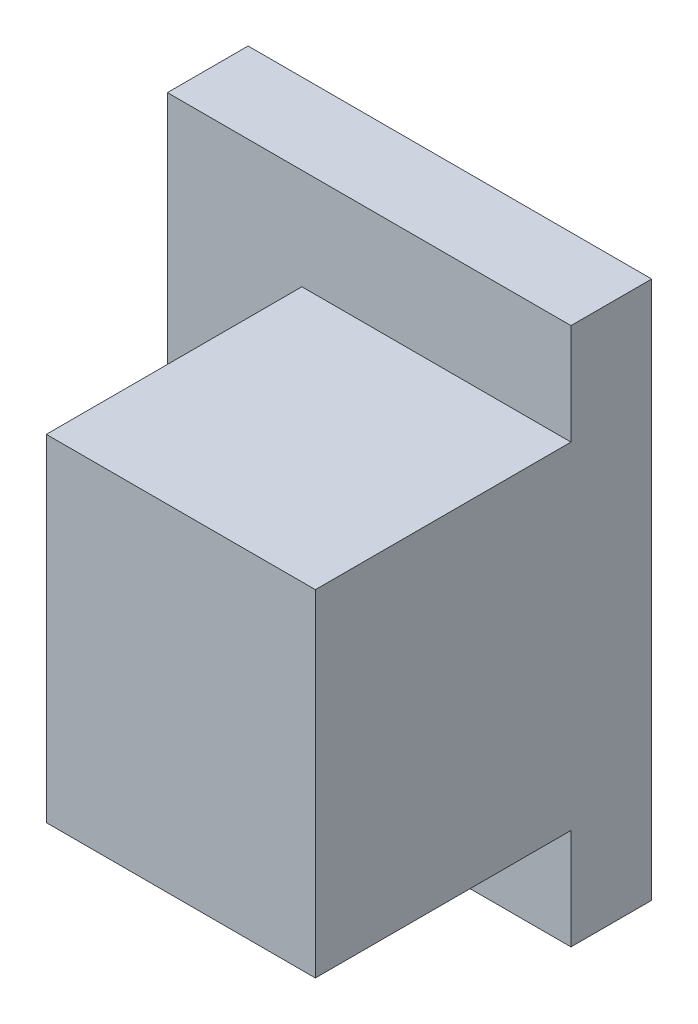
ISO-10303-21;
HEADER;
FILE_DESCRIPTION(('STEP AP214'),'2;1');
FILE_NAME('part.step','',(''),(''),'','','');
FILE_SCHEMA(('AUTOMOTIVE_DESIGN { 1 0 10303 214 1 1 1 1 }'));
ENDSEC;
DATA;
#1=APPLICATION_CONTEXT('core data for automotive mechanical design processes');
#2=APPLICATION_PROTOCOL_DEFINITION('international standard','automotive_design',2000,#1);
#3=PRODUCT_CONTEXT('',#1,'mechanical');
#4=PRODUCT('Part','Part','',(#3));
#5=PRODUCT_RELATED_PRODUCT_CATEGORY('part','',(#4));
#6=PRODUCT_DEFINITION_FORMATION('','',#4);
#7=PRODUCT_DEFINITION_CONTEXT('part definition',#1,'design');
#8=PRODUCT_DEFINITION('design','',#6,#7);
#9=PRODUCT_DEFINITION_SHAPE('','',#8);
#10=(LENGTH_UNIT() NAMED_UNIT(*) SI_UNIT(.MILLI.,.METRE.));
#11=(NAMED_UNIT(*) PLANE_ANGLE_UNIT() SI_UNIT($,.RADIAN.));
#12=(NAMED_UNIT(*) SI_UNIT($,.STERADIAN.) SOLID_ANGLE_UNIT());
#13=UNCERTAINTY_MEASURE_WITH_UNIT(LENGTH_MEASURE(1.E-05),#10,'distance_accuracy_value','');
#14=(GEOMETRIC_REPRESENTATION_CONTEXT(3) GLOBAL_UNCERTAINTY_ASSIGNED_CONTEXT((#13)) GLOBAL_UNIT_ASSIGNED_CONTEXT((#10,
#11,#12)) REPRESENTATION_CONTEXT('',''));
#15=CARTESIAN_POINT('',(0.,0.,0.));
#16=DIRECTION('',(0.,0.,1.));
#17=DIRECTION('',(1.,0.,0.));
#18=AXIS2_PLACEMENT_3D('',#15,#16,#17);
#19=CARTESIAN_POINT('',(-1.,4.,4.));
#20=DIRECTION('',(1.,0.,0.));
#21=DIRECTION('',(0.,1.,0.));
#22=AXIS2_PLACEMENT_3D('',#19,#20,#21);
#23=PLANE('',#22);
#24=DIRECTION('',(0.,-1.,0.));
#25=VECTOR('',#24,1.);
#26=CARTESIAN_POINT('',(-1.,4.,1.2));
#27=LINE('',#26,#25);
#28=CARTESIAN_POINT('',(-1.,4.,1.2));
#29=VERTEX_POINT('',#28);
#30=CARTESIAN_POINT('',(-0.999999999999999,-1.,1.2));
#31=VERTEX_POINT('',#30);
#32=EDGE_CURVE('E53',#29,#31,#27,.T.);
#33=ORIENTED_EDGE('',*,*,#32,.T.);
#34=DIRECTION('',(0.,0.,-1.));
#35=VECTOR('',#34,1.);
#36=CARTESIAN_POINT('',(-0.999999999999999,-1.,4.));
#37=LINE('',#36,#35);
#38=CARTESIAN_POINT('',(-0.999999999999999,-1.,5.));
#39=VERTEX_POINT('',#38);
#40=EDGE_CURVE('E11',#39,#31,#37,.T.);
#41=ORIENTED_EDGE('',*,*,#40,.F.);
#42=DIRECTION('',(0.,-1.,0.));
#43=VECTOR('',#42,1.);
#44=CARTESIAN_POINT('',(-1.,4.,5.));
#45=LINE('',#44,#43);
#46=CARTESIAN_POINT('',(-1.,4.,5.));
#47=VERTEX_POINT('',#46);
#48=EDGE_CURVE('E137',#47,#39,#45,.T.);
#49=ORIENTED_EDGE('',*,*,#48,.F.);
#50=DIRECTION('',(0.,0.,-1.));
#51=VECTOR('',#50,1.);
#52=CARTESIAN_POINT('',(-1.,4.,4.));
#53=LINE('',#52,#51);
#54=EDGE_CURVE('E126',#47,#29,#53,.T.);
#55=ORIENTED_EDGE('',*,*,#54,.T.);
#56=EDGE_LOOP('',(#33,#41,#49,#55));
#57=FACE_BOUND('',#56,.T.);
#58=ADVANCED_FACE('F39',(#57),#23,.F.);
#59=CARTESIAN_POINT('',(-0.999999999999999,-1.,4.));
#60=DIRECTION('',(0.,1.,0.));
#61=DIRECTION('',(0.,0.,1.));
#62=AXIS2_PLACEMENT_3D('',#59,#60,#61);
#63=PLANE('',#62);
#64=DIRECTION('',(1.,0.,0.));
#65=VECTOR('',#64,1.);
#66=CARTESIAN_POINT('',(-0.999999999999999,-1.,1.2));
#67=LINE('',#66,#65);
#68=CARTESIAN_POINT('',(3.,-1.,1.2));
#69=VERTEX_POINT('',#68);
#70=EDGE_CURVE('E59',#31,#69,#67,.T.);
#71=ORIENTED_EDGE('',*,*,#70,.T.);
#72=DIRECTION('',(0.,0.,-1.));
#73=VECTOR('',#72,1.);
#74=CARTESIAN_POINT('',(3.,-1.,4.));
#75=LINE('',#74,#73);
#76=CARTESIAN_POINT('',(3.,-1.,5.));
#77=VERTEX_POINT('',#76);
#78=EDGE_CURVE('E46',#77,#69,#75,.T.);
#79=ORIENTED_EDGE('',*,*,#78,.F.);
#80=DIRECTION('',(1.,0.,0.));
#81=VECTOR('',#80,1.);
#82=CARTESIAN_POINT('',(-0.999999999999999,-1.,5.));
#83=LINE('',#82,#81);
#84=EDGE_CURVE('E141',#39,#77,#83,.T.);
#85=ORIENTED_EDGE('',*,*,#84,.F.);
#86=ORIENTED_EDGE('',*,*,#40,.T.);
#87=EDGE_LOOP('',(#71,#79,#85,#86));
#88=FACE_BOUND('',#87,.T.);
#89=ADVANCED_FACE('F254',(#88),#63,.F.);
#90=CARTESIAN_POINT('',(-1.,4.,4.));
#91=DIRECTION('',(0.,-1.,0.));
#92=DIRECTION('',(0.,0.,-1.));
#93=AXIS2_PLACEMENT_3D('',#90,#91,#92);
#94=PLANE('',#93);
#95=DIRECTION('',(-1.,0.,0.));
#96=VECTOR('',#95,1.);
#97=CARTESIAN_POINT('',(3.,4.,1.2));
#98=LINE('',#97,#96);
#99=CARTESIAN_POINT('',(3.,4.,1.2));
#100=VERTEX_POINT('',#99);
#101=EDGE_CURVE('E132',#100,#29,#98,.T.);
#102=ORIENTED_EDGE('',*,*,#101,.T.);
#103=ORIENTED_EDGE('',*,*,#54,.F.);
#104=DIRECTION('',(-1.,0.,0.));
#105=VECTOR('',#104,1.);
#106=CARTESIAN_POINT('',(3.,4.,5.));
#107=LINE('',#106,#105);
#108=CARTESIAN_POINT('',(3.,4.,5.));
#109=VERTEX_POINT('',#108);
#110=EDGE_CURVE('E130',#109,#47,#107,.T.);
#111=ORIENTED_EDGE('',*,*,#110,.F.);
#112=DIRECTION('',(0.,0.,-1.));
#113=VECTOR('',#112,1.);
#114=CARTESIAN_POINT('',(3.,4.,4.));
#115=LINE('',#114,#113);
#116=EDGE_CURVE('E133',#109,#100,#115,.T.);
#117=ORIENTED_EDGE('',*,*,#116,.T.);
#118=EDGE_LOOP('',(#102,#103,#111,#117));
#119=FACE_BOUND('',#118,.T.);
#120=ADVANCED_FACE('F128',(#119),#94,.F.);
#121=CARTESIAN_POINT('',(0.,0.,0.));
#122=DIRECTION('',(0.,0.,1.));
#123=DIRECTION('',(1.,0.,0.));
#124=AXIS2_PLACEMENT_3D('',#121,#122,#123);
#125=PLANE('',#124);
#126=DIRECTION('',(0.,1.,0.));
#127=VECTOR('',#126,1.);
#128=CARTESIAN_POINT('',(3.,4.,0.));
#129=LINE('',#128,#127);
#130=CARTESIAN_POINT('',(3.,-2.5,0.));
#131=VERTEX_POINT('',#130);
#132=CARTESIAN_POINT('',(3.,5.5,0.));
#133=VERTEX_POINT('',#132);
#134=EDGE_CURVE('E134',#131,#133,#129,.T.);
#135=ORIENTED_EDGE('',*,*,#134,.F.);
#136=DIRECTION('',(-1.,0.,0.));
#137=VECTOR('',#136,1.);
#138=CARTESIAN_POINT('',(3.,-2.5,0.));
#139=LINE('',#138,#137);
#140=CARTESIAN_POINT('',(-3.,-2.5,0.));
#141=VERTEX_POINT('',#140);
#142=EDGE_CURVE('E151',#131,#141,#139,.T.);
#143=ORIENTED_EDGE('',*,*,#142,.T.);
#144=DIRECTION('',(0.,1.,0.));
#145=VECTOR('',#144,1.);
#146=CARTESIAN_POINT('',(-3.,-2.5,0.));
#147=LINE('',#146,#145);
#148=CARTESIAN_POINT('',(-3.,5.5,0.));
#149=VERTEX_POINT('',#148);
#150=EDGE_CURVE('E174',#141,#149,#147,.T.);
#151=ORIENTED_EDGE('',*,*,#150,.T.);
#152=DIRECTION('',(1.,0.,0.));
#153=VECTOR('',#152,1.);
#154=CARTESIAN_POINT('',(-3.,5.5,0.));
#155=LINE('',#154,#153);
#156=EDGE_CURVE('E155',#149,#133,#155,.T.);
#157=ORIENTED_EDGE('',*,*,#156,.T.);
#158=EDGE_LOOP('',(#135,#143,#151,#157));
#159=FACE_BOUND('',#158,.T.);
#160=DIRECTION('',(0.,-1.,0.));
#161=VECTOR('',#160,1.);
#162=CARTESIAN_POINT('',(0.,0.,0.));
#163=LINE('',#162,#161);
#164=CARTESIAN_POINT('',(0.,3.,0.));
#165=VERTEX_POINT('',#164);
#166=CARTESIAN_POINT('',(0.,0.,0.));
#167=VERTEX_POINT('',#166);
#168=EDGE_CURVE('E182',#165,#167,#163,.T.);
#169=ORIENTED_EDGE('',*,*,#168,.T.);
#170=DIRECTION('',(1.,0.,0.));
#171=VECTOR('',#170,1.);
#172=CARTESIAN_POINT('',(0.,0.,0.));
#173=LINE('',#172,#171);
#174=CARTESIAN_POINT('',(2.,0.,0.));
#175=VERTEX_POINT('',#174);
#176=EDGE_CURVE('E205',#167,#175,#173,.T.);
#177=ORIENTED_EDGE('',*,*,#176,.T.);
#178=DIRECTION('',(0.,1.,0.));
#179=VECTOR('',#178,1.);
#180=CARTESIAN_POINT('',(2.,0.,0.));
#181=LINE('',#180,#179);
#182=CARTESIAN_POINT('',(2.,3.,0.));
#183=VERTEX_POINT('',#182);
#184=EDGE_CURVE('E208',#175,#183,#181,.T.);
#185=ORIENTED_EDGE('',*,*,#184,.T.);
#186=DIRECTION('',(-1.,0.,0.));
#187=VECTOR('',#186,1.);
#188=CARTESIAN_POINT('',(0.,3.,0.));
#189=LINE('',#188,#187);
#190=EDGE_CURVE('E193',#183,#165,#189,.T.);
#191=ORIENTED_EDGE('',*,*,#190,.T.);
#192=EDGE_LOOP('',(#169,#177,#185,#191));
#193=FACE_BOUND('',#192,.T.);
#194=ADVANCED_FACE('F240',(#159,#193),#125,.F.);
#195=CARTESIAN_POINT('',(3.,4.,4.));
#196=DIRECTION('',(-1.,0.,0.));
#197=DIRECTION('',(0.,-1.,0.));
#198=AXIS2_PLACEMENT_3D('',#195,#196,#197);
#199=PLANE('',#198);
#200=ORIENTED_EDGE('',*,*,#134,.T.);
#201=DIRECTION('',(0.,0.,-1.));
#202=VECTOR('',#201,1.);
#203=CARTESIAN_POINT('',(3.,5.5,1.2));
#204=LINE('',#203,#202);
#205=CARTESIAN_POINT('',(3.,5.5,1.2));
#206=VERTEX_POINT('',#205);
#207=EDGE_CURVE('E179',#206,#133,#204,.T.);
#208=ORIENTED_EDGE('',*,*,#207,.F.);
#209=DIRECTION('',(0.,-1.,0.));
#210=VECTOR('',#209,1.);
#211=CARTESIAN_POINT('',(3.,5.5,1.2));
#212=LINE('',#211,#210);
#213=EDGE_CURVE('E152',#206,#100,#212,.T.);
#214=ORIENTED_EDGE('',*,*,#213,.T.);
#215=ORIENTED_EDGE('',*,*,#116,.F.);
#216=DIRECTION('',(0.,1.,0.));
#217=VECTOR('',#216,1.);
#218=CARTESIAN_POINT('',(3.,-1.,5.));
#219=LINE('',#218,#217);
#220=EDGE_CURVE('E146',#77,#109,#219,.T.);
#221=ORIENTED_EDGE('',*,*,#220,.F.);
#222=ORIENTED_EDGE('',*,*,#78,.T.);
#223=DIRECTION('',(0.,-1.,0.));
#224=VECTOR('',#223,1.);
#225=CARTESIAN_POINT('',(3.,-1.,1.2));
#226=LINE('',#225,#224);
#227=CARTESIAN_POINT('',(3.,-2.5,1.2));
#228=VERTEX_POINT('',#227);
#229=EDGE_CURVE('E159',#69,#228,#226,.T.);
#230=ORIENTED_EDGE('',*,*,#229,.T.);
#231=DIRECTION('',(0.,0.,-1.));
#232=VECTOR('',#231,1.);
#233=CARTESIAN_POINT('',(3.,-2.5,1.2));
#234=LINE('',#233,#232);
#235=EDGE_CURVE('E171',#228,#131,#234,.T.);
#236=ORIENTED_EDGE('',*,*,#235,.T.);
#237=EDGE_LOOP('',(#200,#208,#214,#215,#221,#222,#230,#236));
#238=FACE_BOUND('',#237,.T.);
#239=ADVANCED_FACE('F225',(#238),#199,.F.);
#240=CARTESIAN_POINT('',(0.,0.,4.));
#241=DIRECTION('',(1.,0.,0.));
#242=DIRECTION('',(0.,0.,-1.));
#243=AXIS2_PLACEMENT_3D('',#240,#241,#242);
#244=PLANE('',#243);
#245=ORIENTED_EDGE('',*,*,#168,.F.);
#246=DIRECTION('',(0.,0.,-1.));
#247=VECTOR('',#246,1.);
#248=CARTESIAN_POINT('',(0.,3.,4.));
#249=LINE('',#248,#247);
#250=CARTESIAN_POINT('',(0.,3.,4.));
#251=VERTEX_POINT('',#250);
#252=EDGE_CURVE('E202',#251,#165,#249,.T.);
#253=ORIENTED_EDGE('',*,*,#252,.F.);
#254=DIRECTION('',(0.,-1.,0.));
#255=VECTOR('',#254,1.);
#256=CARTESIAN_POINT('',(0.,0.,4.));
#257=LINE('',#256,#255);
#258=CARTESIAN_POINT('',(0.,0.,4.));
#259=VERTEX_POINT('',#258);
#260=EDGE_CURVE('E189',#251,#259,#257,.T.);
#261=ORIENTED_EDGE('',*,*,#260,.T.);
#262=DIRECTION('',(0.,0.,-1.));
#263=VECTOR('',#262,1.);
#264=CARTESIAN_POINT('',(0.,0.,4.));
#265=LINE('',#264,#263);
#266=EDGE_CURVE('E219',#259,#167,#265,.T.);
#267=ORIENTED_EDGE('',*,*,#266,.T.);
#268=EDGE_LOOP('',(#245,#253,#261,#267));
#269=FACE_BOUND('',#268,.T.);
#270=ADVANCED_FACE('F264',(#269),#244,.T.);
#271=CARTESIAN_POINT('',(0.,0.,4.));
#272=DIRECTION('',(0.,1.,0.));
#273=DIRECTION('',(0.,0.,1.));
#274=AXIS2_PLACEMENT_3D('',#271,#272,#273);
#275=PLANE('',#274);
#276=ORIENTED_EDGE('',*,*,#176,.F.);
#277=ORIENTED_EDGE('',*,*,#266,.F.);
#278=DIRECTION('',(1.,0.,0.));
#279=VECTOR('',#278,1.);
#280=CARTESIAN_POINT('',(0.,0.,4.));
#281=LINE('',#280,#279);
#282=CARTESIAN_POINT('',(2.,0.,4.));
#283=VERTEX_POINT('',#282);
#284=EDGE_CURVE('E192',#259,#283,#281,.T.);
#285=ORIENTED_EDGE('',*,*,#284,.T.);
#286=DIRECTION('',(0.,0.,-1.));
#287=VECTOR('',#286,1.);
#288=CARTESIAN_POINT('',(2.,0.,4.));
#289=LINE('',#288,#287);
#290=EDGE_CURVE('E217',#283,#175,#289,.T.);
#291=ORIENTED_EDGE('',*,*,#290,.T.);
#292=EDGE_LOOP('',(#276,#277,#285,#291));
#293=FACE_BOUND('',#292,.T.);
#294=ADVANCED_FACE('F270',(#293),#275,.T.);
#295=CARTESIAN_POINT('',(2.,0.,4.));
#296=DIRECTION('',(-1.,0.,0.));
#297=DIRECTION('',(0.,0.,1.));
#298=AXIS2_PLACEMENT_3D('',#295,#296,#297);
#299=PLANE('',#298);
#300=ORIENTED_EDGE('',*,*,#184,.F.);
#301=ORIENTED_EDGE('',*,*,#290,.F.);
#302=DIRECTION('',(0.,1.,0.));
#303=VECTOR('',#302,1.);
#304=CARTESIAN_POINT('',(2.,0.,4.));
#305=LINE('',#304,#303);
#306=CARTESIAN_POINT('',(2.,3.,4.));
#307=VERTEX_POINT('',#306);
#308=EDGE_CURVE('E196',#283,#307,#305,.T.);
#309=ORIENTED_EDGE('',*,*,#308,.T.);
#310=DIRECTION('',(0.,0.,-1.));
#311=VECTOR('',#310,1.);
#312=CARTESIAN_POINT('',(2.,3.,4.));
#313=LINE('',#312,#311);
#314=EDGE_CURVE('E215',#307,#183,#313,.T.);
#315=ORIENTED_EDGE('',*,*,#314,.T.);
#316=EDGE_LOOP('',(#300,#301,#309,#315));
#317=FACE_BOUND('',#316,.T.);
#318=ADVANCED_FACE('F274',(#317),#299,.T.);
#319=CARTESIAN_POINT('',(0.,3.,4.));
#320=DIRECTION('',(0.,-1.,0.));
#321=DIRECTION('',(0.,0.,-1.));
#322=AXIS2_PLACEMENT_3D('',#319,#320,#321);
#323=PLANE('',#322);
#324=ORIENTED_EDGE('',*,*,#190,.F.);
#325=ORIENTED_EDGE('',*,*,#314,.F.);
#326=DIRECTION('',(-1.,0.,0.));
#327=VECTOR('',#326,1.);
#328=CARTESIAN_POINT('',(0.,3.,4.));
#329=LINE('',#328,#327);
#330=EDGE_CURVE('E199',#307,#251,#329,.T.);
#331=ORIENTED_EDGE('',*,*,#330,.T.);
#332=ORIENTED_EDGE('',*,*,#252,.T.);
#333=EDGE_LOOP('',(#324,#325,#331,#332));
#334=FACE_BOUND('',#333,.T.);
#335=ADVANCED_FACE('F251',(#334),#323,.T.);
#336=CARTESIAN_POINT('',(-3.,5.5,1.2));
#337=DIRECTION('',(0.,1.,0.));
#338=DIRECTION('',(-1.,0.,0.));
#339=AXIS2_PLACEMENT_3D('',#336,#337,#338);
#340=PLANE('',#339);
#341=ORIENTED_EDGE('',*,*,#156,.F.);
#342=DIRECTION('',(0.,0.,-1.));
#343=VECTOR('',#342,1.);
#344=CARTESIAN_POINT('',(-3.,5.5,1.2));
#345=LINE('',#344,#343);
#346=CARTESIAN_POINT('',(-3.,5.5,1.2));
#347=VERTEX_POINT('',#346);
#348=EDGE_CURVE('E183',#347,#149,#345,.T.);
#349=ORIENTED_EDGE('',*,*,#348,.F.);
#350=DIRECTION('',(1.,0.,0.));
#351=VECTOR('',#350,1.);
#352=CARTESIAN_POINT('',(-3.,5.5,1.2));
#353=LINE('',#352,#351);
#354=EDGE_CURVE('E168',#347,#206,#353,.T.);
#355=ORIENTED_EDGE('',*,*,#354,.T.);
#356=ORIENTED_EDGE('',*,*,#207,.T.);
#357=EDGE_LOOP('',(#341,#349,#355,#356));
#358=FACE_BOUND('',#357,.T.);
#359=ADVANCED_FACE('F239',(#358),#340,.T.);
#360=CARTESIAN_POINT('',(-3.,-2.5,1.2));
#361=DIRECTION('',(-1.,0.,0.));
#362=DIRECTION('',(0.,0.,1.));
#363=AXIS2_PLACEMENT_3D('',#360,#361,#362);
#364=PLANE('',#363);
#365=ORIENTED_EDGE('',*,*,#150,.F.);
#366=DIRECTION('',(0.,0.,-1.));
#367=VECTOR('',#366,1.);
#368=CARTESIAN_POINT('',(-3.,-2.5,1.2));
#369=LINE('',#368,#367);
#370=CARTESIAN_POINT('',(-3.,-2.5,1.2));
#371=VERTEX_POINT('',#370);
#372=EDGE_CURVE('E185',#371,#141,#369,.T.);
#373=ORIENTED_EDGE('',*,*,#372,.F.);
#374=DIRECTION('',(0.,1.,0.));
#375=VECTOR('',#374,1.);
#376=CARTESIAN_POINT('',(-3.,-2.5,1.2));
#377=LINE('',#376,#375);
#378=EDGE_CURVE('E165',#371,#347,#377,.T.);
#379=ORIENTED_EDGE('',*,*,#378,.T.);
#380=ORIENTED_EDGE('',*,*,#348,.T.);
#381=EDGE_LOOP('',(#365,#373,#379,#380));
#382=FACE_BOUND('',#381,.T.);
#383=ADVANCED_FACE('F243',(#382),#364,.T.);
#384=CARTESIAN_POINT('',(3.,-2.5,1.2));
#385=DIRECTION('',(0.,-1.,0.));
#386=DIRECTION('',(1.,0.,0.));
#387=AXIS2_PLACEMENT_3D('',#384,#385,#386);
#388=PLANE('',#387);
#389=ORIENTED_EDGE('',*,*,#142,.F.);
#390=ORIENTED_EDGE('',*,*,#235,.F.);
#391=DIRECTION('',(-1.,0.,0.));
#392=VECTOR('',#391,1.);
#393=CARTESIAN_POINT('',(3.,-2.5,1.2));
#394=LINE('',#393,#392);
#395=EDGE_CURVE('E162',#228,#371,#394,.T.);
#396=ORIENTED_EDGE('',*,*,#395,.T.);
#397=ORIENTED_EDGE('',*,*,#372,.T.);
#398=EDGE_LOOP('',(#389,#390,#396,#397));
#399=FACE_BOUND('',#398,.T.);
#400=ADVANCED_FACE('F234',(#399),#388,.T.);
#401=CARTESIAN_POINT('',(0.,0.,1.2));
#402=DIRECTION('',(0.,0.,-1.));
#403=DIRECTION('',(-1.,0.,0.));
#404=AXIS2_PLACEMENT_3D('',#401,#402,#403);
#405=PLANE('',#404);
#406=ORIENTED_EDGE('',*,*,#213,.F.);
#407=ORIENTED_EDGE('',*,*,#354,.F.);
#408=ORIENTED_EDGE('',*,*,#378,.F.);
#409=ORIENTED_EDGE('',*,*,#395,.F.);
#410=ORIENTED_EDGE('',*,*,#229,.F.);
#411=ORIENTED_EDGE('',*,*,#70,.F.);
#412=ORIENTED_EDGE('',*,*,#32,.F.);
#413=ORIENTED_EDGE('',*,*,#101,.F.);
#414=EDGE_LOOP('',(#406,#407,#408,#409,#410,#411,#412,#413));
#415=FACE_BOUND('',#414,.T.);
#416=ADVANCED_FACE('F229',(#415),#405,.F.);
#417=CARTESIAN_POINT('',(0.,0.,4.));
#418=DIRECTION('',(0.,0.,1.));
#419=DIRECTION('',(1.,0.,0.));
#420=AXIS2_PLACEMENT_3D('',#417,#418,#419);
#421=PLANE('',#420);
#422=ORIENTED_EDGE('',*,*,#284,.F.);
#423=ORIENTED_EDGE('',*,*,#260,.F.);
#424=ORIENTED_EDGE('',*,*,#330,.F.);
#425=ORIENTED_EDGE('',*,*,#308,.F.);
#426=EDGE_LOOP('',(#422,#423,#424,#425));
#427=FACE_BOUND('',#426,.T.);
#428=ADVANCED_FACE('F289',(#427),#421,.F.);
#429=CARTESIAN_POINT('',(0.,0.,5.));
#430=DIRECTION('',(0.,0.,1.));
#431=DIRECTION('',(1.,0.,0.));
#432=AXIS2_PLACEMENT_3D('',#429,#430,#431);
#433=PLANE('',#432);
#434=ORIENTED_EDGE('',*,*,#110,.T.);
#435=ORIENTED_EDGE('',*,*,#48,.T.);
#436=ORIENTED_EDGE('',*,*,#84,.T.);
#437=ORIENTED_EDGE('',*,*,#220,.T.);
#438=EDGE_LOOP('',(#434,#435,#436,#437));
#439=FACE_BOUND('',#438,.T.);
#440=ADVANCED_FACE('F144',(#439),#433,.T.);
#441=CLOSED_SHELL('',(#58,#89,#120,#194,#239,#270,#294,#318,#335,#359,#383,#400,#416,#428,#440));
#442=MANIFOLD_SOLID_BREP('B2',#441);
#443=ADVANCED_BREP_SHAPE_REPRESENTATION('',(#18,#442),#14);
#444=SHAPE_DEFINITION_REPRESENTATION(#9,#443);
ENDSEC;
END-ISO-10303-21;
